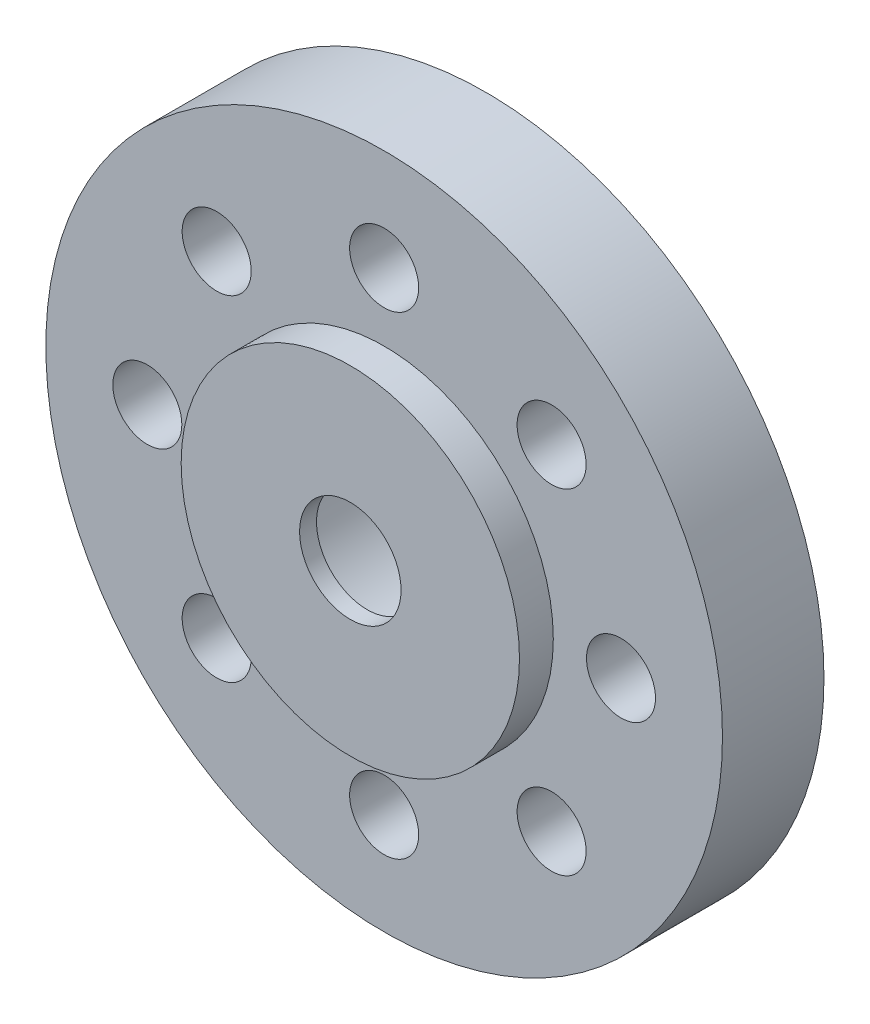
ISO-10303-21;
HEADER;
FILE_DESCRIPTION(('STEP AP214'),'2;1');
FILE_NAME('part.step','',(''),(''),'','','');
FILE_SCHEMA(('AUTOMOTIVE_DESIGN { 1 0 10303 214 1 1 1 1 }'));
ENDSEC;
DATA;
#1=APPLICATION_CONTEXT('core data for automotive mechanical design processes');
#2=APPLICATION_PROTOCOL_DEFINITION('international standard','automotive_design',2000,#1);
#3=PRODUCT_CONTEXT('',#1,'mechanical');
#4=PRODUCT('Part','Part','',(#3));
#5=PRODUCT_RELATED_PRODUCT_CATEGORY('part','',(#4));
#6=PRODUCT_DEFINITION_FORMATION('','',#4);
#7=PRODUCT_DEFINITION_CONTEXT('part definition',#1,'design');
#8=PRODUCT_DEFINITION('design','',#6,#7);
#9=PRODUCT_DEFINITION_SHAPE('','',#8);
#10=(LENGTH_UNIT() NAMED_UNIT(*) SI_UNIT(.MILLI.,.METRE.));
#11=(NAMED_UNIT(*) PLANE_ANGLE_UNIT() SI_UNIT($,.RADIAN.));
#12=(NAMED_UNIT(*) SI_UNIT($,.STERADIAN.) SOLID_ANGLE_UNIT());
#13=UNCERTAINTY_MEASURE_WITH_UNIT(LENGTH_MEASURE(1.E-05),#10,'distance_accuracy_value','');
#14=(GEOMETRIC_REPRESENTATION_CONTEXT(3) GLOBAL_UNCERTAINTY_ASSIGNED_CONTEXT((#13)) GLOBAL_UNIT_ASSIGNED_CONTEXT((#10,
#11,#12)) REPRESENTATION_CONTEXT('',''));
#15=CARTESIAN_POINT('',(0.,0.,0.));
#16=DIRECTION('',(0.,0.,1.));
#17=DIRECTION('',(1.,0.,0.));
#18=AXIS2_PLACEMENT_3D('',#15,#16,#17);
#19=CARTESIAN_POINT('',(-29.978703949288,66.0000000000003,3.));
#20=DIRECTION('',(0.,0.,1.));
#21=DIRECTION('',(1.,0.,0.));
#22=AXIS2_PLACEMENT_3D('',#19,#20,#21);
#23=PLANE('',#22);
#24=CARTESIAN_POINT('',(-29.978703949288,66.0000000000003,3.));
#25=DIRECTION('',(0.,0.,1.));
#26=DIRECTION('',(1.,0.,0.));
#27=AXIS2_PLACEMENT_3D('',#24,#25,#26);
#28=CIRCLE('',#27,5.);
#29=CARTESIAN_POINT('',(-24.978703949288,66.0000000000003,3.));
#30=VERTEX_POINT('',#29);
#31=EDGE_CURVE('E10',#30,#30,#28,.T.);
#32=ORIENTED_EDGE('',*,*,#31,.F.);
#33=EDGE_LOOP('',(#32));
#34=FACE_BOUND('',#33,.T.);
#35=CARTESIAN_POINT('',(-25.0289564809822,70.9497474683051,3.));
#36=DIRECTION('',(0.,0.,1.));
#37=DIRECTION('',(1.,0.,0.));
#38=AXIS2_PLACEMENT_3D('',#35,#36,#37);
#39=CIRCLE('',#38,1.02);
#40=CARTESIAN_POINT('',(-24.0089564809822,70.9497474683051,3.));
#41=VERTEX_POINT('',#40);
#42=EDGE_CURVE('E58',#41,#41,#39,.T.);
#43=ORIENTED_EDGE('',*,*,#42,.F.);
#44=EDGE_LOOP('',(#43));
#45=FACE_BOUND('',#44,.T.);
#46=CARTESIAN_POINT('',(-34.9284514175929,70.9497474683061,3.));
#47=DIRECTION('',(0.,0.,1.));
#48=DIRECTION('',(1.,0.,0.));
#49=AXIS2_PLACEMENT_3D('',#46,#47,#48);
#50=CIRCLE('',#49,1.02);
#51=CARTESIAN_POINT('',(-33.9084514175929,70.9497474683061,3.));
#52=VERTEX_POINT('',#51);
#53=EDGE_CURVE('E70',#52,#52,#50,.T.);
#54=ORIENTED_EDGE('',*,*,#53,.F.);
#55=EDGE_LOOP('',(#54));
#56=FACE_BOUND('',#55,.T.);
#57=CARTESIAN_POINT('',(-34.9284514175939,61.0502525316954,3.));
#58=DIRECTION('',(0.,0.,1.));
#59=DIRECTION('',(1.,0.,0.));
#60=AXIS2_PLACEMENT_3D('',#57,#58,#59);
#61=CIRCLE('',#60,1.02);
#62=CARTESIAN_POINT('',(-33.9084514175939,61.0502525316954,3.));
#63=VERTEX_POINT('',#62);
#64=EDGE_CURVE('E82',#63,#63,#61,.T.);
#65=ORIENTED_EDGE('',*,*,#64,.F.);
#66=EDGE_LOOP('',(#65));
#67=FACE_BOUND('',#66,.T.);
#68=CARTESIAN_POINT('',(-29.978703949288,66.0000000000003,3.));
#69=DIRECTION('',(0.,0.,1.));
#70=DIRECTION('',(1.,0.,0.));
#71=AXIS2_PLACEMENT_3D('',#68,#69,#70);
#72=CIRCLE('',#71,10.);
#73=CARTESIAN_POINT('',(-19.978703949288,66.0000000000003,3.));
#74=VERTEX_POINT('',#73);
#75=EDGE_CURVE('E40',#74,#74,#72,.T.);
#76=ORIENTED_EDGE('',*,*,#75,.T.);
#77=EDGE_LOOP('',(#76));
#78=FACE_BOUND('',#77,.T.);
#79=CARTESIAN_POINT('',(-25.0289564809831,61.0502525316945,3.));
#80=DIRECTION('',(0.,0.,1.));
#81=DIRECTION('',(1.,0.,0.));
#82=AXIS2_PLACEMENT_3D('',#79,#80,#81);
#83=CIRCLE('',#82,1.02);
#84=CARTESIAN_POINT('',(-24.0089564809831,61.0502525316945,3.));
#85=VERTEX_POINT('',#84);
#86=EDGE_CURVE('E94',#85,#85,#83,.T.);
#87=ORIENTED_EDGE('',*,*,#86,.F.);
#88=EDGE_LOOP('',(#87));
#89=FACE_BOUND('',#88,.T.);
#90=CARTESIAN_POINT('',(-29.9787039492887,59.000000000001,3.));
#91=DIRECTION('',(0.,0.,1.));
#92=DIRECTION('',(1.,0.,0.));
#93=AXIS2_PLACEMENT_3D('',#90,#91,#92);
#94=CIRCLE('',#93,1.02);
#95=CARTESIAN_POINT('',(-28.9587039492887,59.000000000001,3.));
#96=VERTEX_POINT('',#95);
#97=EDGE_CURVE('E88',#96,#96,#94,.T.);
#98=ORIENTED_EDGE('',*,*,#97,.F.);
#99=EDGE_LOOP('',(#98));
#100=FACE_BOUND('',#99,.T.);
#101=CARTESIAN_POINT('',(-36.9787039492874,66.000000000001,3.));
#102=DIRECTION('',(0.,0.,1.));
#103=DIRECTION('',(1.,0.,0.));
#104=AXIS2_PLACEMENT_3D('',#101,#102,#103);
#105=CIRCLE('',#104,1.01999999999999);
#106=CARTESIAN_POINT('',(-35.9587039492874,66.000000000001,3.));
#107=VERTEX_POINT('',#106);
#108=EDGE_CURVE('E76',#107,#107,#105,.T.);
#109=ORIENTED_EDGE('',*,*,#108,.F.);
#110=EDGE_LOOP('',(#109));
#111=FACE_BOUND('',#110,.T.);
#112=CARTESIAN_POINT('',(-29.9787039492873,72.9999999999996,3.));
#113=DIRECTION('',(0.,0.,1.));
#114=DIRECTION('',(1.,0.,0.));
#115=AXIS2_PLACEMENT_3D('',#112,#113,#114);
#116=CIRCLE('',#115,1.02);
#117=CARTESIAN_POINT('',(-28.9587039492873,72.9999999999996,3.));
#118=VERTEX_POINT('',#117);
#119=EDGE_CURVE('E64',#118,#118,#116,.T.);
#120=ORIENTED_EDGE('',*,*,#119,.F.);
#121=EDGE_LOOP('',(#120));
#122=FACE_BOUND('',#121,.T.);
#123=CARTESIAN_POINT('',(-22.9787039492887,65.9999999999996,3.));
#124=DIRECTION('',(0.,0.,1.));
#125=DIRECTION('',(1.,0.,0.));
#126=AXIS2_PLACEMENT_3D('',#123,#124,#125);
#127=CIRCLE('',#126,1.02000000000001);
#128=CARTESIAN_POINT('',(-21.9587039492887,65.9999999999996,3.));
#129=VERTEX_POINT('',#128);
#130=EDGE_CURVE('E51',#129,#129,#127,.T.);
#131=ORIENTED_EDGE('',*,*,#130,.F.);
#132=EDGE_LOOP('',(#131));
#133=FACE_BOUND('',#132,.T.);
#134=ADVANCED_FACE('F32',(#34,#45,#56,#67,#78,#89,#100,#111,#122,#133),#23,.T.);
#135=CARTESIAN_POINT('',(-29.978703949288,66.0000000000003,0.));
#136=DIRECTION('',(0.,0.,1.));
#137=DIRECTION('',(1.,0.,0.));
#138=AXIS2_PLACEMENT_3D('',#135,#136,#137);
#139=PLANE('',#138);
#140=CARTESIAN_POINT('',(-29.978703949288,66.0000000000003,0.));
#141=DIRECTION('',(0.,0.,1.));
#142=DIRECTION('',(1.,0.,0.));
#143=AXIS2_PLACEMENT_3D('',#140,#141,#142);
#144=CIRCLE('',#143,3.);
#145=CARTESIAN_POINT('',(-26.978703949288,66.0000000000003,0.));
#146=VERTEX_POINT('',#145);
#147=EDGE_CURVE('E100',#146,#146,#144,.F.);
#148=ORIENTED_EDGE('',*,*,#147,.F.);
#149=EDGE_LOOP('',(#148));
#150=FACE_BOUND('',#149,.T.);
#151=CARTESIAN_POINT('',(-29.978703949288,66.0000000000003,0.));
#152=DIRECTION('',(0.,0.,1.));
#153=DIRECTION('',(1.,0.,0.));
#154=AXIS2_PLACEMENT_3D('',#151,#152,#153);
#155=CIRCLE('',#154,10.);
#156=CARTESIAN_POINT('',(-19.978703949288,66.0000000000003,0.));
#157=VERTEX_POINT('',#156);
#158=EDGE_CURVE('E45',#157,#157,#155,.T.);
#159=ORIENTED_EDGE('',*,*,#158,.F.);
#160=EDGE_LOOP('',(#159));
#161=FACE_BOUND('',#160,.T.);
#162=CARTESIAN_POINT('',(-25.0289564809831,61.0502525316945,0.));
#163=DIRECTION('',(0.,0.,1.));
#164=DIRECTION('',(1.,0.,0.));
#165=AXIS2_PLACEMENT_3D('',#162,#163,#164);
#166=CIRCLE('',#165,1.02);
#167=CARTESIAN_POINT('',(-24.0089564809831,61.0502525316945,0.));
#168=VERTEX_POINT('',#167);
#169=EDGE_CURVE('E91',#168,#168,#166,.T.);
#170=ORIENTED_EDGE('',*,*,#169,.T.);
#171=EDGE_LOOP('',(#170));
#172=FACE_BOUND('',#171,.T.);
#173=CARTESIAN_POINT('',(-29.9787039492887,59.000000000001,0.));
#174=DIRECTION('',(0.,0.,1.));
#175=DIRECTION('',(1.,0.,0.));
#176=AXIS2_PLACEMENT_3D('',#173,#174,#175);
#177=CIRCLE('',#176,1.02);
#178=CARTESIAN_POINT('',(-28.9587039492887,59.000000000001,0.));
#179=VERTEX_POINT('',#178);
#180=EDGE_CURVE('E85',#179,#179,#177,.T.);
#181=ORIENTED_EDGE('',*,*,#180,.T.);
#182=EDGE_LOOP('',(#181));
#183=FACE_BOUND('',#182,.T.);
#184=CARTESIAN_POINT('',(-34.9284514175939,61.0502525316954,0.));
#185=DIRECTION('',(0.,0.,1.));
#186=DIRECTION('',(1.,0.,0.));
#187=AXIS2_PLACEMENT_3D('',#184,#185,#186);
#188=CIRCLE('',#187,1.02);
#189=CARTESIAN_POINT('',(-33.9084514175939,61.0502525316954,0.));
#190=VERTEX_POINT('',#189);
#191=EDGE_CURVE('E79',#190,#190,#188,.T.);
#192=ORIENTED_EDGE('',*,*,#191,.T.);
#193=EDGE_LOOP('',(#192));
#194=FACE_BOUND('',#193,.T.);
#195=CARTESIAN_POINT('',(-36.9787039492874,66.000000000001,0.));
#196=DIRECTION('',(0.,0.,1.));
#197=DIRECTION('',(1.,0.,0.));
#198=AXIS2_PLACEMENT_3D('',#195,#196,#197);
#199=CIRCLE('',#198,1.01999999999999);
#200=CARTESIAN_POINT('',(-35.9587039492874,66.000000000001,0.));
#201=VERTEX_POINT('',#200);
#202=EDGE_CURVE('E73',#201,#201,#199,.T.);
#203=ORIENTED_EDGE('',*,*,#202,.T.);
#204=EDGE_LOOP('',(#203));
#205=FACE_BOUND('',#204,.T.);
#206=CARTESIAN_POINT('',(-34.9284514175929,70.9497474683061,0.));
#207=DIRECTION('',(0.,0.,1.));
#208=DIRECTION('',(1.,0.,0.));
#209=AXIS2_PLACEMENT_3D('',#206,#207,#208);
#210=CIRCLE('',#209,1.02);
#211=CARTESIAN_POINT('',(-33.9084514175929,70.9497474683061,0.));
#212=VERTEX_POINT('',#211);
#213=EDGE_CURVE('E67',#212,#212,#210,.T.);
#214=ORIENTED_EDGE('',*,*,#213,.T.);
#215=EDGE_LOOP('',(#214));
#216=FACE_BOUND('',#215,.T.);
#217=CARTESIAN_POINT('',(-29.9787039492873,72.9999999999996,0.));
#218=DIRECTION('',(0.,0.,1.));
#219=DIRECTION('',(1.,0.,0.));
#220=AXIS2_PLACEMENT_3D('',#217,#218,#219);
#221=CIRCLE('',#220,1.02);
#222=CARTESIAN_POINT('',(-28.9587039492873,72.9999999999996,0.));
#223=VERTEX_POINT('',#222);
#224=EDGE_CURVE('E61',#223,#223,#221,.T.);
#225=ORIENTED_EDGE('',*,*,#224,.T.);
#226=EDGE_LOOP('',(#225));
#227=FACE_BOUND('',#226,.T.);
#228=CARTESIAN_POINT('',(-25.0289564809822,70.9497474683051,0.));
#229=DIRECTION('',(0.,0.,1.));
#230=DIRECTION('',(1.,0.,0.));
#231=AXIS2_PLACEMENT_3D('',#228,#229,#230);
#232=CIRCLE('',#231,1.02);
#233=CARTESIAN_POINT('',(-24.0089564809822,70.9497474683051,0.));
#234=VERTEX_POINT('',#233);
#235=EDGE_CURVE('E54',#234,#234,#232,.T.);
#236=ORIENTED_EDGE('',*,*,#235,.T.);
#237=EDGE_LOOP('',(#236));
#238=FACE_BOUND('',#237,.T.);
#239=CARTESIAN_POINT('',(-22.9787039492887,65.9999999999996,0.));
#240=DIRECTION('',(0.,0.,1.));
#241=DIRECTION('',(1.,0.,0.));
#242=AXIS2_PLACEMENT_3D('',#239,#240,#241);
#243=CIRCLE('',#242,1.02000000000001);
#244=CARTESIAN_POINT('',(-21.9587039492887,65.9999999999996,0.));
#245=VERTEX_POINT('',#244);
#246=EDGE_CURVE('E55',#245,#245,#243,.T.);
#247=ORIENTED_EDGE('',*,*,#246,.T.);
#248=EDGE_LOOP('',(#247));
#249=FACE_BOUND('',#248,.T.);
#250=ADVANCED_FACE('F131',(#150,#161,#172,#183,#194,#205,#216,#227,#238,#249),#139,.F.);
#251=CARTESIAN_POINT('',(-29.978703949288,66.0000000000003,3.));
#252=DIRECTION('',(0.,0.,-1.));
#253=DIRECTION('',(-1.,0.,0.));
#254=AXIS2_PLACEMENT_3D('',#251,#252,#253);
#255=CYLINDRICAL_SURFACE('',#254,10.);
#256=ORIENTED_EDGE('',*,*,#75,.F.);
#257=EDGE_LOOP('',(#256));
#258=FACE_BOUND('',#257,.T.);
#259=ORIENTED_EDGE('',*,*,#158,.T.);
#260=EDGE_LOOP('',(#259));
#261=FACE_BOUND('',#260,.T.);
#262=ADVANCED_FACE('F34',(#258,#261),#255,.T.);
#263=CARTESIAN_POINT('',(-25.0289564809831,61.0502525316945,3.));
#264=DIRECTION('',(0.,0.,-1.));
#265=DIRECTION('',(-1.,0.,0.));
#266=AXIS2_PLACEMENT_3D('',#263,#264,#265);
#267=CYLINDRICAL_SURFACE('',#266,1.02);
#268=ORIENTED_EDGE('',*,*,#86,.T.);
#269=EDGE_LOOP('',(#268));
#270=FACE_BOUND('',#269,.T.);
#271=ORIENTED_EDGE('',*,*,#169,.F.);
#272=EDGE_LOOP('',(#271));
#273=FACE_BOUND('',#272,.T.);
#274=ADVANCED_FACE('F140',(#270,#273),#267,.F.);
#275=CARTESIAN_POINT('',(-29.9787039492887,59.000000000001,3.));
#276=DIRECTION('',(0.,0.,-1.));
#277=DIRECTION('',(-1.,0.,0.));
#278=AXIS2_PLACEMENT_3D('',#275,#276,#277);
#279=CYLINDRICAL_SURFACE('',#278,1.02);
#280=ORIENTED_EDGE('',*,*,#97,.T.);
#281=EDGE_LOOP('',(#280));
#282=FACE_BOUND('',#281,.T.);
#283=ORIENTED_EDGE('',*,*,#180,.F.);
#284=EDGE_LOOP('',(#283));
#285=FACE_BOUND('',#284,.T.);
#286=ADVANCED_FACE('F143',(#282,#285),#279,.F.);
#287=CARTESIAN_POINT('',(-34.9284514175939,61.0502525316954,3.));
#288=DIRECTION('',(0.,0.,-1.));
#289=DIRECTION('',(-1.,0.,0.));
#290=AXIS2_PLACEMENT_3D('',#287,#288,#289);
#291=CYLINDRICAL_SURFACE('',#290,1.02);
#292=ORIENTED_EDGE('',*,*,#64,.T.);
#293=EDGE_LOOP('',(#292));
#294=FACE_BOUND('',#293,.T.);
#295=ORIENTED_EDGE('',*,*,#191,.F.);
#296=EDGE_LOOP('',(#295));
#297=FACE_BOUND('',#296,.T.);
#298=ADVANCED_FACE('F147',(#294,#297),#291,.F.);
#299=CARTESIAN_POINT('',(-36.9787039492874,66.000000000001,3.));
#300=DIRECTION('',(0.,0.,-1.));
#301=DIRECTION('',(-1.,0.,0.));
#302=AXIS2_PLACEMENT_3D('',#299,#300,#301);
#303=CYLINDRICAL_SURFACE('',#302,1.01999999999999);
#304=ORIENTED_EDGE('',*,*,#108,.T.);
#305=EDGE_LOOP('',(#304));
#306=FACE_BOUND('',#305,.T.);
#307=ORIENTED_EDGE('',*,*,#202,.F.);
#308=EDGE_LOOP('',(#307));
#309=FACE_BOUND('',#308,.T.);
#310=ADVANCED_FACE('F151',(#306,#309),#303,.F.);
#311=CARTESIAN_POINT('',(-34.9284514175929,70.9497474683061,3.));
#312=DIRECTION('',(0.,0.,-1.));
#313=DIRECTION('',(-1.,0.,0.));
#314=AXIS2_PLACEMENT_3D('',#311,#312,#313);
#315=CYLINDRICAL_SURFACE('',#314,1.02);
#316=ORIENTED_EDGE('',*,*,#53,.T.);
#317=EDGE_LOOP('',(#316));
#318=FACE_BOUND('',#317,.T.);
#319=ORIENTED_EDGE('',*,*,#213,.F.);
#320=EDGE_LOOP('',(#319));
#321=FACE_BOUND('',#320,.T.);
#322=ADVANCED_FACE('F155',(#318,#321),#315,.F.);
#323=CARTESIAN_POINT('',(-29.9787039492873,72.9999999999996,3.));
#324=DIRECTION('',(0.,0.,-1.));
#325=DIRECTION('',(-1.,0.,0.));
#326=AXIS2_PLACEMENT_3D('',#323,#324,#325);
#327=CYLINDRICAL_SURFACE('',#326,1.02);
#328=ORIENTED_EDGE('',*,*,#119,.T.);
#329=EDGE_LOOP('',(#328));
#330=FACE_BOUND('',#329,.T.);
#331=ORIENTED_EDGE('',*,*,#224,.F.);
#332=EDGE_LOOP('',(#331));
#333=FACE_BOUND('',#332,.T.);
#334=ADVANCED_FACE('F159',(#330,#333),#327,.F.);
#335=CARTESIAN_POINT('',(-25.0289564809822,70.9497474683051,3.));
#336=DIRECTION('',(0.,0.,-1.));
#337=DIRECTION('',(-1.,0.,0.));
#338=AXIS2_PLACEMENT_3D('',#335,#336,#337);
#339=CYLINDRICAL_SURFACE('',#338,1.02);
#340=ORIENTED_EDGE('',*,*,#42,.T.);
#341=EDGE_LOOP('',(#340));
#342=FACE_BOUND('',#341,.T.);
#343=ORIENTED_EDGE('',*,*,#235,.F.);
#344=EDGE_LOOP('',(#343));
#345=FACE_BOUND('',#344,.T.);
#346=ADVANCED_FACE('F163',(#342,#345),#339,.F.);
#347=CARTESIAN_POINT('',(-22.9787039492887,65.9999999999996,3.));
#348=DIRECTION('',(0.,0.,-1.));
#349=DIRECTION('',(-1.,0.,0.));
#350=AXIS2_PLACEMENT_3D('',#347,#348,#349);
#351=CYLINDRICAL_SURFACE('',#350,1.02000000000001);
#352=ORIENTED_EDGE('',*,*,#130,.T.);
#353=EDGE_LOOP('',(#352));
#354=FACE_BOUND('',#353,.T.);
#355=ORIENTED_EDGE('',*,*,#246,.F.);
#356=EDGE_LOOP('',(#355));
#357=FACE_BOUND('',#356,.T.);
#358=ADVANCED_FACE('F167',(#354,#357),#351,.F.);
#359=CARTESIAN_POINT('',(-29.978703949288,66.0000000000003,4.));
#360=DIRECTION('',(0.,0.,1.));
#361=DIRECTION('',(1.,0.,0.));
#362=AXIS2_PLACEMENT_3D('',#359,#360,#361);
#363=PLANE('',#362);
#364=CARTESIAN_POINT('',(-29.978703949288,66.0000000000003,4.));
#365=DIRECTION('',(0.,0.,1.));
#366=DIRECTION('',(1.,0.,0.));
#367=AXIS2_PLACEMENT_3D('',#364,#365,#366);
#368=CIRCLE('',#367,1.5);
#369=CARTESIAN_POINT('',(-28.478703949288,66.0000000000003,4.));
#370=VERTEX_POINT('',#369);
#371=EDGE_CURVE('E36',#370,#370,#368,.T.);
#372=ORIENTED_EDGE('',*,*,#371,.F.);
#373=EDGE_LOOP('',(#372));
#374=FACE_BOUND('',#373,.T.);
#375=CARTESIAN_POINT('',(-29.978703949288,66.0000000000003,4.));
#376=DIRECTION('',(0.,0.,1.));
#377=DIRECTION('',(1.,0.,0.));
#378=AXIS2_PLACEMENT_3D('',#375,#376,#377);
#379=CIRCLE('',#378,5.);
#380=CARTESIAN_POINT('',(-24.978703949288,66.0000000000003,4.));
#381=VERTEX_POINT('',#380);
#382=EDGE_CURVE('E49',#381,#381,#379,.T.);
#383=ORIENTED_EDGE('',*,*,#382,.T.);
#384=EDGE_LOOP('',(#383));
#385=FACE_BOUND('',#384,.T.);
#386=ADVANCED_FACE('F171',(#374,#385),#363,.T.);
#387=CARTESIAN_POINT('',(-29.978703949288,66.0000000000003,4.));
#388=DIRECTION('',(0.,0.,-1.));
#389=DIRECTION('',(-1.,0.,0.));
#390=AXIS2_PLACEMENT_3D('',#387,#388,#389);
#391=CYLINDRICAL_SURFACE('',#390,5.);
#392=ORIENTED_EDGE('',*,*,#382,.F.);
#393=EDGE_LOOP('',(#392));
#394=FACE_BOUND('',#393,.T.);
#395=ORIENTED_EDGE('',*,*,#31,.T.);
#396=EDGE_LOOP('',(#395));
#397=FACE_BOUND('',#396,.T.);
#398=ADVANCED_FACE('F127',(#394,#397),#391,.T.);
#399=CARTESIAN_POINT('',(-29.978703949288,66.0000000000003,-7.));
#400=DIRECTION('',(0.,0.,1.));
#401=DIRECTION('',(1.,0.,0.));
#402=AXIS2_PLACEMENT_3D('',#399,#400,#401);
#403=CYLINDRICAL_SURFACE('',#402,3.);
#404=CARTESIAN_POINT('',(-29.978703949288,66.0000000000003,3.5));
#405=DIRECTION('',(0.,0.,-1.));
#406=DIRECTION('',(-1.,0.,0.));
#407=AXIS2_PLACEMENT_3D('',#404,#405,#406);
#408=CIRCLE('',#407,3.);
#409=CARTESIAN_POINT('',(-32.978703949288,66.0000000000003,3.5));
#410=VERTEX_POINT('',#409);
#411=EDGE_CURVE('E102',#410,#410,#408,.T.);
#412=ORIENTED_EDGE('',*,*,#411,.F.);
#413=EDGE_LOOP('',(#412));
#414=FACE_BOUND('',#413,.T.);
#415=ORIENTED_EDGE('',*,*,#147,.T.);
#416=EDGE_LOOP('',(#415));
#417=FACE_BOUND('',#416,.T.);
#418=ADVANCED_FACE('F119',(#414,#417),#403,.F.);
#419=CARTESIAN_POINT('',(-29.978703949288,66.0000000000003,3.5));
#420=DIRECTION('',(0.,0.,-1.));
#421=DIRECTION('',(-1.,0.,0.));
#422=AXIS2_PLACEMENT_3D('',#419,#420,#421);
#423=PLANE('',#422);
#424=CARTESIAN_POINT('',(-29.978703949288,66.0000000000003,3.5));
#425=DIRECTION('',(0.,0.,-1.));
#426=DIRECTION('',(-1.,0.,0.));
#427=AXIS2_PLACEMENT_3D('',#424,#425,#426);
#428=CIRCLE('',#427,1.5);
#429=CARTESIAN_POINT('',(-31.478703949288,66.0000000000003,3.5));
#430=VERTEX_POINT('',#429);
#431=EDGE_CURVE('E110',#430,#430,#428,.T.);
#432=ORIENTED_EDGE('',*,*,#431,.F.);
#433=EDGE_LOOP('',(#432));
#434=FACE_BOUND('',#433,.T.);
#435=ORIENTED_EDGE('',*,*,#411,.T.);
#436=EDGE_LOOP('',(#435));
#437=FACE_BOUND('',#436,.T.);
#438=ADVANCED_FACE('F117',(#434,#437),#423,.T.);
#439=CARTESIAN_POINT('',(-29.978703949288,66.0000000000003,12.));
#440=DIRECTION('',(0.,0.,-1.));
#441=DIRECTION('',(-1.,0.,0.));
#442=AXIS2_PLACEMENT_3D('',#439,#440,#441);
#443=CYLINDRICAL_SURFACE('',#442,1.5);
#444=ORIENTED_EDGE('',*,*,#371,.T.);
#445=EDGE_LOOP('',(#444));
#446=FACE_BOUND('',#445,.T.);
#447=ORIENTED_EDGE('',*,*,#431,.T.);
#448=EDGE_LOOP('',(#447));
#449=FACE_BOUND('',#448,.T.);
#450=ADVANCED_FACE('F115',(#446,#449),#443,.F.);
#451=CLOSED_SHELL('',(#134,#250,#262,#274,#286,#298,#310,#322,#334,#346,#358,#386,#398,#418,
#438,#450));
#452=MANIFOLD_SOLID_BREP('B2',#451);
#453=ADVANCED_BREP_SHAPE_REPRESENTATION('',(#18,#452),#14);
#454=SHAPE_DEFINITION_REPRESENTATION(#9,#453);
ENDSEC;
END-ISO-10303-21;
